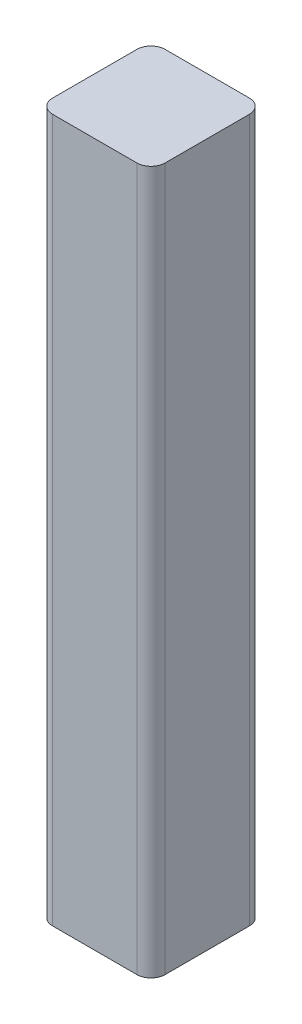
ISO-10303-21;
HEADER;
FILE_DESCRIPTION(('STEP AP214'),'2;1');
FILE_NAME('part.step','',(''),(''),'','','');
FILE_SCHEMA(('AUTOMOTIVE_DESIGN { 1 0 10303 214 1 1 1 1 }'));
ENDSEC;
DATA;
#1=APPLICATION_CONTEXT('core data for automotive mechanical design processes');
#2=APPLICATION_PROTOCOL_DEFINITION('international standard','automotive_design',2000,#1);
#3=PRODUCT_CONTEXT('',#1,'mechanical');
#4=PRODUCT('Part','Part','',(#3));
#5=PRODUCT_RELATED_PRODUCT_CATEGORY('part','',(#4));
#6=PRODUCT_DEFINITION_FORMATION('','',#4);
#7=PRODUCT_DEFINITION_CONTEXT('part definition',#1,'design');
#8=PRODUCT_DEFINITION('design','',#6,#7);
#9=PRODUCT_DEFINITION_SHAPE('','',#8);
#10=(LENGTH_UNIT() NAMED_UNIT(*) SI_UNIT(.MILLI.,.METRE.));
#11=(NAMED_UNIT(*) PLANE_ANGLE_UNIT() SI_UNIT($,.RADIAN.));
#12=(NAMED_UNIT(*) SI_UNIT($,.STERADIAN.) SOLID_ANGLE_UNIT());
#13=UNCERTAINTY_MEASURE_WITH_UNIT(LENGTH_MEASURE(1.E-05),#10,'distance_accuracy_value','');
#14=(GEOMETRIC_REPRESENTATION_CONTEXT(3) GLOBAL_UNCERTAINTY_ASSIGNED_CONTEXT((#13)) GLOBAL_UNIT_ASSIGNED_CONTEXT((#10,
#11,#12)) REPRESENTATION_CONTEXT('',''));
#15=CARTESIAN_POINT('',(0.,0.,0.));
#16=DIRECTION('',(0.,0.,1.));
#17=DIRECTION('',(1.,0.,0.));
#18=AXIS2_PLACEMENT_3D('',#15,#16,#17);
#19=CARTESIAN_POINT('',(-8.,50.2898987664353,-8.24520799785443));
#20=DIRECTION('',(-1.,0.,0.));
#21=DIRECTION('',(0.,-1.,0.));
#22=AXIS2_PLACEMENT_3D('',#19,#20,#21);
#23=PLANE('',#22);
#24=DIRECTION('',(0.,0.,1.));
#25=VECTOR('',#24,1.);
#26=CARTESIAN_POINT('',(-8.,50.2898987664353,-8.24520799785443));
#27=LINE('',#26,#25);
#28=CARTESIAN_POINT('',(-8.,50.2898987664353,-6.24520799785443));
#29=VERTEX_POINT('',#28);
#30=CARTESIAN_POINT('',(-8.,50.2898987664353,5.75479200214557));
#31=VERTEX_POINT('',#30);
#32=EDGE_CURVE('E101',#29,#31,#27,.T.);
#33=ORIENTED_EDGE('',*,*,#32,.F.);
#34=DIRECTION('',(0.,-1.,0.));
#35=VECTOR('',#34,1.);
#36=CARTESIAN_POINT('',(-7.99999999999999,-49.7101012335647,-6.24520799785443));
#37=LINE('',#36,#35);
#38=CARTESIAN_POINT('',(-7.99999999999999,-49.7101012335647,-6.24520799785443));
#39=VERTEX_POINT('',#38);
#40=EDGE_CURVE('E114',#29,#39,#37,.T.);
#41=ORIENTED_EDGE('',*,*,#40,.T.);
#42=DIRECTION('',(0.,0.,1.));
#43=VECTOR('',#42,1.);
#44=CARTESIAN_POINT('',(-7.99999999999999,-49.7101012335647,-8.24520799785443));
#45=LINE('',#44,#43);
#46=CARTESIAN_POINT('',(-7.99999999999999,-49.7101012335647,5.75479200214557));
#47=VERTEX_POINT('',#46);
#48=EDGE_CURVE('E158',#39,#47,#45,.T.);
#49=ORIENTED_EDGE('',*,*,#48,.T.);
#50=DIRECTION('',(0.,-1.,0.));
#51=VECTOR('',#50,1.);
#52=CARTESIAN_POINT('',(-8.,50.2898987664353,5.75479200214557));
#53=LINE('',#52,#51);
#54=EDGE_CURVE('E117',#47,#31,#53,.F.);
#55=ORIENTED_EDGE('',*,*,#54,.T.);
#56=EDGE_LOOP('',(#33,#41,#49,#55));
#57=FACE_BOUND('',#56,.T.);
#58=ADVANCED_FACE('F32',(#57),#23,.T.);
#59=CARTESIAN_POINT('',(-8.,50.2898987664353,-8.24520799785443));
#60=DIRECTION('',(0.,1.,0.));
#61=DIRECTION('',(0.,0.,1.));
#62=AXIS2_PLACEMENT_3D('',#59,#60,#61);
#63=PLANE('',#62);
#64=DIRECTION('',(-1.,0.,0.));
#65=VECTOR('',#64,1.);
#66=CARTESIAN_POINT('',(-8.,50.2898987664353,-8.24520799785443));
#67=LINE('',#66,#65);
#68=CARTESIAN_POINT('',(6.,50.2898987664353,-8.24520799785443));
#69=VERTEX_POINT('',#68);
#70=CARTESIAN_POINT('',(-6.,50.2898987664353,-8.24520799785443));
#71=VERTEX_POINT('',#70);
#72=EDGE_CURVE('E104',#69,#71,#67,.T.);
#73=ORIENTED_EDGE('',*,*,#72,.T.);
#74=CARTESIAN_POINT('',(-6.,50.2898987664353,-6.24520799785443));
#75=DIRECTION('',(0.,1.,0.));
#76=DIRECTION('',(0.,0.,1.));
#77=AXIS2_PLACEMENT_3D('',#74,#75,#76);
#78=CIRCLE('',#77,2.);
#79=EDGE_CURVE('E98',#71,#29,#78,.T.);
#80=ORIENTED_EDGE('',*,*,#79,.T.);
#81=ORIENTED_EDGE('',*,*,#32,.T.);
#82=CARTESIAN_POINT('',(-6.,50.2898987664353,5.75479200214557));
#83=DIRECTION('',(0.,1.,0.));
#84=DIRECTION('',(0.,0.,1.));
#85=AXIS2_PLACEMENT_3D('',#82,#83,#84);
#86=CIRCLE('',#85,2.);
#87=CARTESIAN_POINT('',(-6.,50.2898987664353,7.75479200214557));
#88=VERTEX_POINT('',#87);
#89=EDGE_CURVE('E109',#31,#88,#86,.T.);
#90=ORIENTED_EDGE('',*,*,#89,.T.);
#91=DIRECTION('',(-1.,0.,0.));
#92=VECTOR('',#91,1.);
#93=CARTESIAN_POINT('',(-8.,50.2898987664353,7.75479200214557));
#94=LINE('',#93,#92);
#95=CARTESIAN_POINT('',(6.,50.2898987664353,7.75479200214557));
#96=VERTEX_POINT('',#95);
#97=EDGE_CURVE('E164',#96,#88,#94,.T.);
#98=ORIENTED_EDGE('',*,*,#97,.F.);
#99=CARTESIAN_POINT('',(6.,50.2898987664353,5.75479200214557));
#100=DIRECTION('',(0.,1.,0.));
#101=DIRECTION('',(0.,0.,1.));
#102=AXIS2_PLACEMENT_3D('',#99,#100,#101);
#103=CIRCLE('',#102,2.);
#104=CARTESIAN_POINT('',(8.,50.2898987664353,5.75479200214557));
#105=VERTEX_POINT('',#104);
#106=EDGE_CURVE('E47',#96,#105,#103,.T.);
#107=ORIENTED_EDGE('',*,*,#106,.T.);
#108=DIRECTION('',(0.,0.,1.));
#109=VECTOR('',#108,1.);
#110=CARTESIAN_POINT('',(8.,50.2898987664353,-8.24520799785443));
#111=LINE('',#110,#109);
#112=CARTESIAN_POINT('',(8.,50.2898987664353,-6.24520799785443));
#113=VERTEX_POINT('',#112);
#114=EDGE_CURVE('E118',#113,#105,#111,.T.);
#115=ORIENTED_EDGE('',*,*,#114,.F.);
#116=CARTESIAN_POINT('',(6.,50.2898987664353,-6.24520799785443));
#117=DIRECTION('',(0.,1.,0.));
#118=DIRECTION('',(0.,0.,1.));
#119=AXIS2_PLACEMENT_3D('',#116,#117,#118);
#120=CIRCLE('',#119,2.);
#121=EDGE_CURVE('E55',#113,#69,#120,.T.);
#122=ORIENTED_EDGE('',*,*,#121,.T.);
#123=EDGE_LOOP('',(#73,#80,#81,#90,#98,#107,#115,#122));
#124=FACE_BOUND('',#123,.T.);
#125=ADVANCED_FACE('F100',(#124),#63,.T.);
#126=CARTESIAN_POINT('',(8.,50.2898987664353,-8.24520799785443));
#127=DIRECTION('',(1.,0.,0.));
#128=DIRECTION('',(0.,1.,0.));
#129=AXIS2_PLACEMENT_3D('',#126,#127,#128);
#130=PLANE('',#129);
#131=DIRECTION('',(0.,0.,1.));
#132=VECTOR('',#131,1.);
#133=CARTESIAN_POINT('',(8.00000000000001,-49.7101012335647,-8.24520799785443));
#134=LINE('',#133,#132);
#135=CARTESIAN_POINT('',(8.00000000000001,-49.7101012335647,-6.24520799785443));
#136=VERTEX_POINT('',#135);
#137=CARTESIAN_POINT('',(8.00000000000001,-49.7101012335647,5.75479200214557));
#138=VERTEX_POINT('',#137);
#139=EDGE_CURVE('E149',#136,#138,#134,.T.);
#140=ORIENTED_EDGE('',*,*,#139,.F.);
#141=DIRECTION('',(0.,1.,0.));
#142=VECTOR('',#141,1.);
#143=CARTESIAN_POINT('',(8.,50.2898987664353,-6.24520799785443));
#144=LINE('',#143,#142);
#145=EDGE_CURVE('E11',#136,#113,#144,.T.);
#146=ORIENTED_EDGE('',*,*,#145,.T.);
#147=ORIENTED_EDGE('',*,*,#114,.T.);
#148=DIRECTION('',(0.,1.,0.));
#149=VECTOR('',#148,1.);
#150=CARTESIAN_POINT('',(8.,50.2898987664353,5.75479200214557));
#151=LINE('',#150,#149);
#152=EDGE_CURVE('E40',#105,#138,#151,.F.);
#153=ORIENTED_EDGE('',*,*,#152,.T.);
#154=EDGE_LOOP('',(#140,#146,#147,#153));
#155=FACE_BOUND('',#154,.T.);
#156=ADVANCED_FACE('F148',(#155),#130,.T.);
#157=CARTESIAN_POINT('',(-7.99999999999999,-49.7101012335647,-8.24520799785443));
#158=DIRECTION('',(0.,-1.,0.));
#159=DIRECTION('',(0.,0.,-1.));
#160=AXIS2_PLACEMENT_3D('',#157,#158,#159);
#161=PLANE('',#160);
#162=ORIENTED_EDGE('',*,*,#48,.F.);
#163=CARTESIAN_POINT('',(-5.99999999999999,-49.7101012335647,-6.24520799785443));
#164=DIRECTION('',(0.,-1.,0.));
#165=DIRECTION('',(0.,0.,-1.));
#166=AXIS2_PLACEMENT_3D('',#163,#164,#165);
#167=CIRCLE('',#166,2.);
#168=CARTESIAN_POINT('',(-5.99999999999999,-49.7101012335647,-8.24520799785443));
#169=VERTEX_POINT('',#168);
#170=EDGE_CURVE('E121',#39,#169,#167,.T.);
#171=ORIENTED_EDGE('',*,*,#170,.T.);
#172=DIRECTION('',(1.,0.,0.));
#173=VECTOR('',#172,1.);
#174=CARTESIAN_POINT('',(-7.99999999999999,-49.7101012335647,-8.24520799785443));
#175=LINE('',#174,#173);
#176=CARTESIAN_POINT('',(6.00000000000001,-49.7101012335647,-8.24520799785443));
#177=VERTEX_POINT('',#176);
#178=EDGE_CURVE('E167',#169,#177,#175,.T.);
#179=ORIENTED_EDGE('',*,*,#178,.T.);
#180=CARTESIAN_POINT('',(6.00000000000001,-49.7101012335647,-6.24520799785443));
#181=DIRECTION('',(0.,-1.,0.));
#182=DIRECTION('',(0.,0.,-1.));
#183=AXIS2_PLACEMENT_3D('',#180,#181,#182);
#184=CIRCLE('',#183,2.);
#185=EDGE_CURVE('E124',#177,#136,#184,.T.);
#186=ORIENTED_EDGE('',*,*,#185,.T.);
#187=ORIENTED_EDGE('',*,*,#139,.T.);
#188=CARTESIAN_POINT('',(6.00000000000001,-49.7101012335647,5.75479200214557));
#189=DIRECTION('',(0.,-1.,0.));
#190=DIRECTION('',(0.,0.,-1.));
#191=AXIS2_PLACEMENT_3D('',#188,#189,#190);
#192=CIRCLE('',#191,2.);
#193=CARTESIAN_POINT('',(6.00000000000001,-49.7101012335647,7.75479200214557));
#194=VERTEX_POINT('',#193);
#195=EDGE_CURVE('E122',#138,#194,#192,.T.);
#196=ORIENTED_EDGE('',*,*,#195,.T.);
#197=DIRECTION('',(1.,0.,0.));
#198=VECTOR('',#197,1.);
#199=CARTESIAN_POINT('',(-7.99999999999999,-49.7101012335647,7.75479200214557));
#200=LINE('',#199,#198);
#201=CARTESIAN_POINT('',(-5.99999999999999,-49.7101012335647,7.75479200214557));
#202=VERTEX_POINT('',#201);
#203=EDGE_CURVE('E166',#202,#194,#200,.T.);
#204=ORIENTED_EDGE('',*,*,#203,.F.);
#205=CARTESIAN_POINT('',(-5.99999999999999,-49.7101012335647,5.75479200214557));
#206=DIRECTION('',(0.,-1.,0.));
#207=DIRECTION('',(0.,0.,-1.));
#208=AXIS2_PLACEMENT_3D('',#205,#206,#207);
#209=CIRCLE('',#208,2.);
#210=EDGE_CURVE('E130',#202,#47,#209,.T.);
#211=ORIENTED_EDGE('',*,*,#210,.T.);
#212=EDGE_LOOP('',(#162,#171,#179,#186,#187,#196,#204,#211));
#213=FACE_BOUND('',#212,.T.);
#214=ADVANCED_FACE('F153',(#213),#161,.T.);
#215=CARTESIAN_POINT('',(0.,0.,-8.24520799785443));
#216=DIRECTION('',(0.,0.,1.));
#217=DIRECTION('',(1.,0.,0.));
#218=AXIS2_PLACEMENT_3D('',#215,#216,#217);
#219=PLANE('',#218);
#220=ORIENTED_EDGE('',*,*,#178,.F.);
#221=DIRECTION('',(0.,-1.,0.));
#222=VECTOR('',#221,1.);
#223=CARTESIAN_POINT('',(-6.,50.2898987664353,-8.24520799785443));
#224=LINE('',#223,#222);
#225=EDGE_CURVE('E135',#169,#71,#224,.F.);
#226=ORIENTED_EDGE('',*,*,#225,.T.);
#227=ORIENTED_EDGE('',*,*,#72,.F.);
#228=DIRECTION('',(0.,1.,0.));
#229=VECTOR('',#228,1.);
#230=CARTESIAN_POINT('',(6.00000000000001,-49.7101012335647,-8.24520799785443));
#231=LINE('',#230,#229);
#232=EDGE_CURVE('E133',#69,#177,#231,.F.);
#233=ORIENTED_EDGE('',*,*,#232,.T.);
#234=EDGE_LOOP('',(#220,#226,#227,#233));
#235=FACE_BOUND('',#234,.T.);
#236=ADVANCED_FACE('F192',(#235),#219,.F.);
#237=CARTESIAN_POINT('',(0.,0.,7.75479200214557));
#238=DIRECTION('',(0.,0.,1.));
#239=DIRECTION('',(1.,0.,0.));
#240=AXIS2_PLACEMENT_3D('',#237,#238,#239);
#241=PLANE('',#240);
#242=ORIENTED_EDGE('',*,*,#97,.T.);
#243=DIRECTION('',(0.,-1.,0.));
#244=VECTOR('',#243,1.);
#245=CARTESIAN_POINT('',(-6.,0.,7.75479200214557));
#246=LINE('',#245,#244);
#247=EDGE_CURVE('E142',#88,#202,#246,.T.);
#248=ORIENTED_EDGE('',*,*,#247,.T.);
#249=ORIENTED_EDGE('',*,*,#203,.T.);
#250=DIRECTION('',(0.,1.,0.));
#251=VECTOR('',#250,1.);
#252=CARTESIAN_POINT('',(6.,0.,7.75479200214557));
#253=LINE('',#252,#251);
#254=EDGE_CURVE('E108',#194,#96,#253,.T.);
#255=ORIENTED_EDGE('',*,*,#254,.T.);
#256=EDGE_LOOP('',(#242,#248,#249,#255));
#257=FACE_BOUND('',#256,.T.);
#258=ADVANCED_FACE('F163',(#257),#241,.T.);
#259=CARTESIAN_POINT('',(-6.,50.2898987664353,-6.24520799785443));
#260=DIRECTION('',(0.,1.,0.));
#261=DIRECTION('',(-1.,0.,0.));
#262=AXIS2_PLACEMENT_3D('',#259,#260,#261);
#263=CYLINDRICAL_SURFACE('',#262,2.);
#264=ORIENTED_EDGE('',*,*,#79,.F.);
#265=ORIENTED_EDGE('',*,*,#225,.F.);
#266=ORIENTED_EDGE('',*,*,#170,.F.);
#267=ORIENTED_EDGE('',*,*,#40,.F.);
#268=EDGE_LOOP('',(#264,#265,#266,#267));
#269=FACE_BOUND('',#268,.T.);
#270=ADVANCED_FACE('F120',(#269),#263,.T.);
#271=CARTESIAN_POINT('',(-6.,0.,5.75479200214557));
#272=DIRECTION('',(0.,-1.,0.));
#273=DIRECTION('',(1.,0.,0.));
#274=AXIS2_PLACEMENT_3D('',#271,#272,#273);
#275=CYLINDRICAL_SURFACE('',#274,2.);
#276=ORIENTED_EDGE('',*,*,#89,.F.);
#277=ORIENTED_EDGE('',*,*,#54,.F.);
#278=ORIENTED_EDGE('',*,*,#210,.F.);
#279=ORIENTED_EDGE('',*,*,#247,.F.);
#280=EDGE_LOOP('',(#276,#277,#278,#279));
#281=FACE_BOUND('',#280,.T.);
#282=ADVANCED_FACE('F174',(#281),#275,.T.);
#283=CARTESIAN_POINT('',(6.,50.2898987664353,-6.24520799785443));
#284=DIRECTION('',(0.,-1.,0.));
#285=DIRECTION('',(1.,0.,0.));
#286=AXIS2_PLACEMENT_3D('',#283,#284,#285);
#287=CYLINDRICAL_SURFACE('',#286,2.);
#288=ORIENTED_EDGE('',*,*,#185,.F.);
#289=ORIENTED_EDGE('',*,*,#232,.F.);
#290=ORIENTED_EDGE('',*,*,#121,.F.);
#291=ORIENTED_EDGE('',*,*,#145,.F.);
#292=EDGE_LOOP('',(#288,#289,#290,#291));
#293=FACE_BOUND('',#292,.T.);
#294=ADVANCED_FACE('F176',(#293),#287,.T.);
#295=CARTESIAN_POINT('',(6.,0.,5.75479200214557));
#296=DIRECTION('',(0.,1.,0.));
#297=DIRECTION('',(-1.,0.,0.));
#298=AXIS2_PLACEMENT_3D('',#295,#296,#297);
#299=CYLINDRICAL_SURFACE('',#298,2.);
#300=ORIENTED_EDGE('',*,*,#195,.F.);
#301=ORIENTED_EDGE('',*,*,#152,.F.);
#302=ORIENTED_EDGE('',*,*,#106,.F.);
#303=ORIENTED_EDGE('',*,*,#254,.F.);
#304=EDGE_LOOP('',(#300,#301,#302,#303));
#305=FACE_BOUND('',#304,.T.);
#306=ADVANCED_FACE('F34',(#305),#299,.T.);
#307=CLOSED_SHELL('',(#58,#125,#156,#214,#236,#258,#270,#282,#294,#306));
#308=MANIFOLD_SOLID_BREP('B2',#307);
#309=ADVANCED_BREP_SHAPE_REPRESENTATION('',(#18,#308),#14);
#310=SHAPE_DEFINITION_REPRESENTATION(#9,#309);
ENDSEC;
END-ISO-10303-21;
